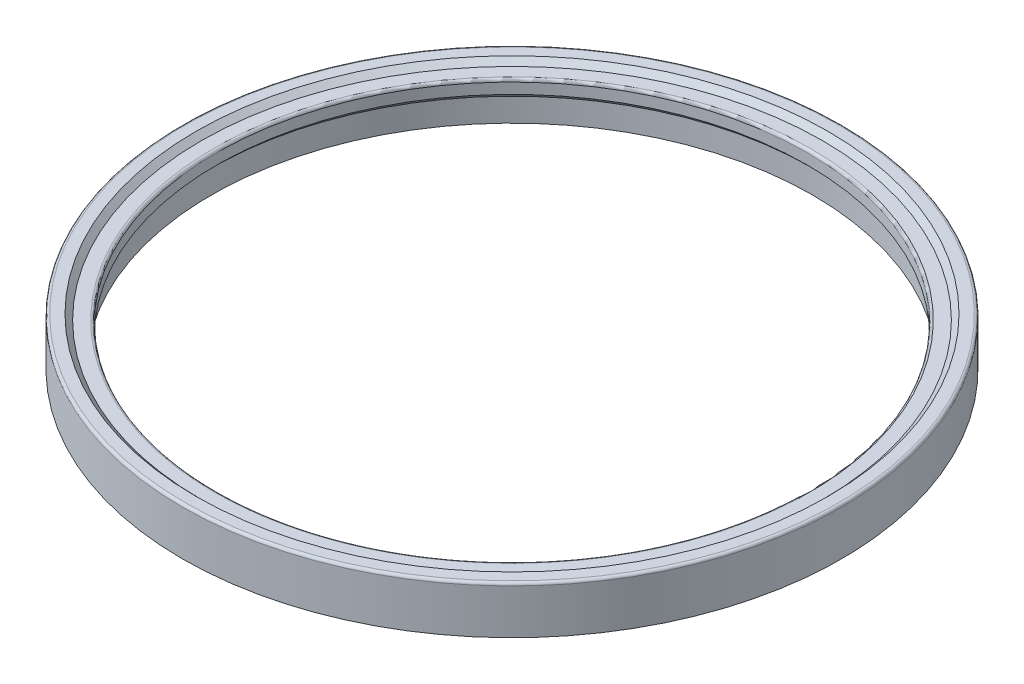
ISO-10303-21;
HEADER;
FILE_DESCRIPTION(('STEP AP214'),'2;1');
FILE_NAME('part.step','',(''),(''),'','','');
FILE_SCHEMA(('AUTOMOTIVE_DESIGN { 1 0 10303 214 1 1 1 1 }'));
ENDSEC;
DATA;
#1=APPLICATION_CONTEXT('core data for automotive mechanical design processes');
#2=APPLICATION_PROTOCOL_DEFINITION('international standard','automotive_design',2000,#1);
#3=PRODUCT_CONTEXT('',#1,'mechanical');
#4=PRODUCT('Part','Part','',(#3));
#5=PRODUCT_RELATED_PRODUCT_CATEGORY('part','',(#4));
#6=PRODUCT_DEFINITION_FORMATION('','',#4);
#7=PRODUCT_DEFINITION_CONTEXT('part definition',#1,'design');
#8=PRODUCT_DEFINITION('design','',#6,#7);
#9=PRODUCT_DEFINITION_SHAPE('','',#8);
#10=(LENGTH_UNIT() NAMED_UNIT(*) SI_UNIT(.MILLI.,.METRE.));
#11=(NAMED_UNIT(*) PLANE_ANGLE_UNIT() SI_UNIT($,.RADIAN.));
#12=(NAMED_UNIT(*) SI_UNIT($,.STERADIAN.) SOLID_ANGLE_UNIT());
#13=UNCERTAINTY_MEASURE_WITH_UNIT(LENGTH_MEASURE(1.E-05),#10,'distance_accuracy_value','');
#14=(GEOMETRIC_REPRESENTATION_CONTEXT(3) GLOBAL_UNCERTAINTY_ASSIGNED_CONTEXT((#13)) GLOBAL_UNIT_ASSIGNED_CONTEXT((#10,
#11,#12)) REPRESENTATION_CONTEXT('',''));
#15=CARTESIAN_POINT('',(0.,0.,0.));
#16=DIRECTION('',(0.,0.,1.));
#17=DIRECTION('',(1.,0.,0.));
#18=AXIS2_PLACEMENT_3D('',#15,#16,#17);
#19=CARTESIAN_POINT('',(0.,-10.9999999999939,0.));
#20=DIRECTION('',(0.,-1.,0.));
#21=DIRECTION('',(0.,0.,-1.));
#22=AXIS2_PLACEMENT_3D('',#19,#20,#21);
#23=PLANE('',#22);
#24=CARTESIAN_POINT('',(0.,-10.9999999999878,0.));
#25=DIRECTION('',(0.,-1.,0.));
#26=DIRECTION('',(0.,0.,-1.));
#27=AXIS2_PLACEMENT_3D('',#24,#25,#26);
#28=CIRCLE('',#27,124.);
#29=CARTESIAN_POINT('',(0.,-10.9999999999878,-124.));
#30=VERTEX_POINT('',#29);
#31=EDGE_CURVE('E10',#30,#30,#28,.T.);
#32=ORIENTED_EDGE('',*,*,#31,.F.);
#33=EDGE_LOOP('',(#32));
#34=FACE_BOUND('',#33,.T.);
#35=CARTESIAN_POINT('',(0.,-11.,0.));
#36=DIRECTION('',(0.,-1.,0.));
#37=DIRECTION('',(0.,0.,-1.));
#38=AXIS2_PLACEMENT_3D('',#35,#36,#37);
#39=CIRCLE('',#38,119.899137802865);
#40=CARTESIAN_POINT('',(0.,-11.,-119.899137802865));
#41=VERTEX_POINT('',#40);
#42=EDGE_CURVE('E88',#41,#41,#39,.T.);
#43=ORIENTED_EDGE('',*,*,#42,.T.);
#44=EDGE_LOOP('',(#43));
#45=FACE_BOUND('',#44,.T.);
#46=ADVANCED_FACE('F45',(#34,#45),#23,.F.);
#47=CARTESIAN_POINT('',(0.,-11.9999999999878,0.));
#48=DIRECTION('',(0.,-1.,0.));
#49=DIRECTION('',(0.,0.,-1.));
#50=AXIS2_PLACEMENT_3D('',#47,#48,#49);
#51=TOROIDAL_SURFACE('',#50,124.,1.);
#52=CARTESIAN_POINT('',(0.,-11.9999999999878,0.));
#53=DIRECTION('',(0.,-1.,0.));
#54=DIRECTION('',(0.,0.,-1.));
#55=AXIS2_PLACEMENT_3D('',#52,#53,#54);
#56=CIRCLE('',#55,125.);
#57=CARTESIAN_POINT('',(0.,-11.9999999999878,-125.));
#58=VERTEX_POINT('',#57);
#59=EDGE_CURVE('E52',#58,#58,#56,.T.);
#60=ORIENTED_EDGE('',*,*,#59,.F.);
#61=EDGE_LOOP('',(#60));
#62=FACE_BOUND('',#61,.T.);
#63=ORIENTED_EDGE('',*,*,#31,.T.);
#64=EDGE_LOOP('',(#63));
#65=FACE_BOUND('',#64,.T.);
#66=ADVANCED_FACE('F198',(#62,#65),#51,.T.);
#67=CARTESIAN_POINT('',(0.,0.,0.));
#68=DIRECTION('',(0.,-1.,0.));
#69=DIRECTION('',(0.,0.,-1.));
#70=AXIS2_PLACEMENT_3D('',#67,#68,#69);
#71=CYLINDRICAL_SURFACE('',#70,125.);
#72=CARTESIAN_POINT('',(0.,-28.9999999999878,0.));
#73=DIRECTION('',(0.,-1.,0.));
#74=DIRECTION('',(0.,0.,-1.));
#75=AXIS2_PLACEMENT_3D('',#72,#73,#74);
#76=CIRCLE('',#75,125.);
#77=CARTESIAN_POINT('',(0.,-28.9999999999878,-125.));
#78=VERTEX_POINT('',#77);
#79=EDGE_CURVE('E57',#78,#78,#76,.T.);
#80=ORIENTED_EDGE('',*,*,#79,.F.);
#81=EDGE_LOOP('',(#80));
#82=FACE_BOUND('',#81,.T.);
#83=ORIENTED_EDGE('',*,*,#59,.T.);
#84=EDGE_LOOP('',(#83));
#85=FACE_BOUND('',#84,.T.);
#86=ADVANCED_FACE('F186',(#82,#85),#71,.T.);
#87=CARTESIAN_POINT('',(0.,-28.9999999999878,0.));
#88=DIRECTION('',(0.,1.,0.));
#89=DIRECTION('',(0.,0.,1.));
#90=AXIS2_PLACEMENT_3D('',#87,#88,#89);
#91=PLANE('',#90);
#92=CARTESIAN_POINT('',(70.2550322802566,-28.9999999999878,-96.6977562526665));
#93=DIRECTION('',(0.,-1.,0.));
#94=DIRECTION('',(0.587785252292462,0.,-0.809016994374955));
#95=AXIS2_PLACEMENT_3D('',#92,#93,#94);
#96=CIRCLE('',#95,1.85);
#97=CARTESIAN_POINT('',(71.3424349969976,-28.9999999999878,-98.1944376922602));
#98=VERTEX_POINT('',#97);
#99=EDGE_CURVE('E109',#98,#98,#96,.T.);
#100=ORIENTED_EDGE('',*,*,#99,.F.);
#101=EDGE_LOOP('',(#100));
#102=FACE_BOUND('',#101,.T.);
#103=CARTESIAN_POINT('',(113.675030110178,-28.9999999999878,-36.9352562526669));
#104=DIRECTION('',(0.,-1.,0.));
#105=DIRECTION('',(0.95105651629515,0.,-0.309016994374958));
#106=AXIS2_PLACEMENT_3D('',#103,#104,#105);
#107=CIRCLE('',#106,1.85);
#108=CARTESIAN_POINT('',(115.434484665324,-28.9999999999878,-37.5069376922605));
#109=VERTEX_POINT('',#108);
#110=EDGE_CURVE('E117',#109,#109,#107,.T.);
#111=ORIENTED_EDGE('',*,*,#110,.F.);
#112=EDGE_LOOP('',(#111));
#113=FACE_BOUND('',#112,.T.);
#114=CARTESIAN_POINT('',(113.675030110179,-28.9999999999878,36.9352562526645));
#115=DIRECTION('',(0.,-1.,0.));
#116=DIRECTION('',(0.951056516295157,0.,0.309016994374938));
#117=AXIS2_PLACEMENT_3D('',#114,#115,#116);
#118=CIRCLE('',#117,1.85);
#119=CARTESIAN_POINT('',(115.434484665325,-28.9999999999878,37.5069376922581));
#120=VERTEX_POINT('',#119);
#121=EDGE_CURVE('E125',#120,#120,#118,.T.);
#122=ORIENTED_EDGE('',*,*,#121,.F.);
#123=EDGE_LOOP('',(#122));
#124=FACE_BOUND('',#123,.T.);
#125=CARTESIAN_POINT('',(70.2550322802587,-28.9999999999878,96.697756252665));
#126=DIRECTION('',(0.,-1.,0.));
#127=DIRECTION('',(0.58778525229248,0.,0.809016994374942));
#128=AXIS2_PLACEMENT_3D('',#125,#126,#127);
#129=CIRCLE('',#128,1.85);
#130=CARTESIAN_POINT('',(71.3424349969998,-28.9999999999878,98.1944376922586));
#131=VERTEX_POINT('',#130);
#132=EDGE_CURVE('E133',#131,#131,#129,.T.);
#133=ORIENTED_EDGE('',*,*,#132,.F.);
#134=EDGE_LOOP('',(#133));
#135=FACE_BOUND('',#134,.T.);
#136=CARTESIAN_POINT('',(0.,-28.9999999999878,119.525));
#137=DIRECTION('',(0.,-1.,0.));
#138=DIRECTION('',(0.,0.,1.));
#139=AXIS2_PLACEMENT_3D('',#136,#137,#138);
#140=CIRCLE('',#139,1.85);
#141=CARTESIAN_POINT('',(0.,-28.9999999999878,121.375));
#142=VERTEX_POINT('',#141);
#143=EDGE_CURVE('E141',#142,#142,#140,.T.);
#144=ORIENTED_EDGE('',*,*,#143,.F.);
#145=EDGE_LOOP('',(#144));
#146=FACE_BOUND('',#145,.T.);
#147=CARTESIAN_POINT('',(-70.2550322802573,-28.9999999999878,96.697756252666));
#148=DIRECTION('',(0.,-1.,0.));
#149=DIRECTION('',(-0.587785252292469,0.,0.809016994374951));
#150=AXIS2_PLACEMENT_3D('',#147,#148,#149);
#151=CIRCLE('',#150,1.85);
#152=CARTESIAN_POINT('',(-71.3424349969984,-28.9999999999878,98.1944376922597));
#153=VERTEX_POINT('',#152);
#154=EDGE_CURVE('E149',#153,#153,#151,.T.);
#155=ORIENTED_EDGE('',*,*,#154,.F.);
#156=EDGE_LOOP('',(#155));
#157=FACE_BOUND('',#156,.T.);
#158=CARTESIAN_POINT('',(-113.675030110178,-28.9999999999878,36.9352562526661));
#159=DIRECTION('',(0.,-1.,0.));
#160=DIRECTION('',(-0.951056516295152,0.,0.309016994374952));
#161=AXIS2_PLACEMENT_3D('',#158,#159,#160);
#162=CIRCLE('',#161,1.85);
#163=CARTESIAN_POINT('',(-115.434484665324,-28.9999999999878,37.5069376922597));
#164=VERTEX_POINT('',#163);
#165=EDGE_CURVE('E157',#164,#164,#162,.T.);
#166=ORIENTED_EDGE('',*,*,#165,.F.);
#167=EDGE_LOOP('',(#166));
#168=FACE_BOUND('',#167,.T.);
#169=CARTESIAN_POINT('',(-113.675030110178,-28.9999999999878,-36.9352562526653));
#170=DIRECTION('',(0.,-1.,0.));
#171=DIRECTION('',(-0.951056516295155,0.,-0.309016994374945));
#172=AXIS2_PLACEMENT_3D('',#169,#170,#171);
#173=CIRCLE('',#172,1.85);
#174=CARTESIAN_POINT('',(-115.434484665324,-28.9999999999878,-37.5069376922589));
#175=VERTEX_POINT('',#174);
#176=EDGE_CURVE('E165',#175,#175,#173,.T.);
#177=ORIENTED_EDGE('',*,*,#176,.F.);
#178=EDGE_LOOP('',(#177));
#179=FACE_BOUND('',#178,.T.);
#180=CARTESIAN_POINT('',(-70.255032280258,-28.9999999999878,-96.6977562526655));
#181=DIRECTION('',(0.,-1.,0.));
#182=DIRECTION('',(-0.587785252292474,0.,-0.809016994374947));
#183=AXIS2_PLACEMENT_3D('',#180,#181,#182);
#184=CIRCLE('',#183,1.85);
#185=CARTESIAN_POINT('',(-71.3424349969991,-28.9999999999878,-98.1944376922592));
#186=VERTEX_POINT('',#185);
#187=EDGE_CURVE('E101',#186,#186,#184,.T.);
#188=ORIENTED_EDGE('',*,*,#187,.F.);
#189=EDGE_LOOP('',(#188));
#190=FACE_BOUND('',#189,.T.);
#191=CARTESIAN_POINT('',(0.,-28.9999999999878,-119.525));
#192=DIRECTION('',(0.,-1.,0.));
#193=DIRECTION('',(0.,0.,-1.));
#194=AXIS2_PLACEMENT_3D('',#191,#192,#193);
#195=CIRCLE('',#194,1.85);
#196=CARTESIAN_POINT('',(0.,-28.9999999999878,-121.375));
#197=VERTEX_POINT('',#196);
#198=EDGE_CURVE('E93',#197,#197,#195,.T.);
#199=ORIENTED_EDGE('',*,*,#198,.F.);
#200=EDGE_LOOP('',(#199));
#201=FACE_BOUND('',#200,.T.);
#202=CARTESIAN_POINT('',(0.,-28.9999999999878,0.));
#203=DIRECTION('',(0.,-1.,0.));
#204=DIRECTION('',(0.,0.,-1.));
#205=AXIS2_PLACEMENT_3D('',#202,#203,#204);
#206=CIRCLE('',#205,114.05);
#207=CARTESIAN_POINT('',(0.,-28.9999999999878,-114.05));
#208=VERTEX_POINT('',#207);
#209=EDGE_CURVE('E62',#208,#208,#206,.T.);
#210=ORIENTED_EDGE('',*,*,#209,.F.);
#211=EDGE_LOOP('',(#210));
#212=FACE_BOUND('',#211,.T.);
#213=ORIENTED_EDGE('',*,*,#79,.T.);
#214=EDGE_LOOP('',(#213));
#215=FACE_BOUND('',#214,.T.);
#216=ADVANCED_FACE('F182',(#102,#113,#124,#135,#146,#157,#168,#179,#190,#201,#212,#215),#91,.F.);
#217=CARTESIAN_POINT('',(0.,0.,0.));
#218=DIRECTION('',(0.,-1.,0.));
#219=DIRECTION('',(0.,0.,-1.));
#220=AXIS2_PLACEMENT_3D('',#217,#218,#219);
#221=CYLINDRICAL_SURFACE('',#220,114.05);
#222=ORIENTED_EDGE('',*,*,#209,.T.);
#223=EDGE_LOOP('',(#222));
#224=FACE_BOUND('',#223,.T.);
#225=CARTESIAN_POINT('',(0.,-20.1508621971352,0.));
#226=DIRECTION('',(0.,-1.,0.));
#227=DIRECTION('',(0.,0.,-1.));
#228=AXIS2_PLACEMENT_3D('',#225,#226,#227);
#229=CIRCLE('',#228,114.05);
#230=CARTESIAN_POINT('',(0.,-20.1508621971352,-114.05));
#231=VERTEX_POINT('',#230);
#232=EDGE_CURVE('E68',#231,#231,#229,.T.);
#233=ORIENTED_EDGE('',*,*,#232,.F.);
#234=EDGE_LOOP('',(#233));
#235=FACE_BOUND('',#234,.T.);
#236=ADVANCED_FACE('F185',(#224,#235),#221,.F.);
#237=CARTESIAN_POINT('',(0.,-18.1008621971352,0.));
#238=DIRECTION('',(0.,-1.,0.));
#239=DIRECTION('',(0.,0.,-1.));
#240=AXIS2_PLACEMENT_3D('',#237,#238,#239);
#241=CONICAL_SURFACE('',#240,112.,0.785398163397449);
#242=ORIENTED_EDGE('',*,*,#232,.T.);
#243=EDGE_LOOP('',(#242));
#244=FACE_BOUND('',#243,.T.);
#245=CARTESIAN_POINT('',(0.,-18.1008621971352,0.));
#246=DIRECTION('',(0.,-1.,0.));
#247=DIRECTION('',(0.,0.,-1.));
#248=AXIS2_PLACEMENT_3D('',#245,#246,#247);
#249=CIRCLE('',#248,112.);
#250=CARTESIAN_POINT('',(0.,-18.1008621971352,-112.));
#251=VERTEX_POINT('',#250);
#252=EDGE_CURVE('E72',#251,#251,#249,.T.);
#253=ORIENTED_EDGE('',*,*,#252,.F.);
#254=EDGE_LOOP('',(#253));
#255=FACE_BOUND('',#254,.T.);
#256=ADVANCED_FACE('F233',(#244,#255),#241,.F.);
#257=CARTESIAN_POINT('',(0.,0.,0.));
#258=DIRECTION('',(0.,-1.,0.));
#259=DIRECTION('',(0.,0.,-1.));
#260=AXIS2_PLACEMENT_3D('',#257,#258,#259);
#261=CYLINDRICAL_SURFACE('',#260,112.);
#262=ORIENTED_EDGE('',*,*,#252,.T.);
#263=EDGE_LOOP('',(#262));
#264=FACE_BOUND('',#263,.T.);
#265=CARTESIAN_POINT('',(0.,-14.0499999999878,0.));
#266=DIRECTION('',(0.,-1.,0.));
#267=DIRECTION('',(0.,0.,-1.));
#268=AXIS2_PLACEMENT_3D('',#265,#266,#267);
#269=CIRCLE('',#268,112.);
#270=CARTESIAN_POINT('',(0.,-14.0499999999878,-112.));
#271=VERTEX_POINT('',#270);
#272=EDGE_CURVE('E76',#271,#271,#269,.T.);
#273=ORIENTED_EDGE('',*,*,#272,.F.);
#274=EDGE_LOOP('',(#273));
#275=FACE_BOUND('',#274,.T.);
#276=ADVANCED_FACE('F226',(#264,#275),#261,.F.);
#277=CARTESIAN_POINT('',(0.,-14.0499999999878,0.));
#278=DIRECTION('',(0.,-1.,0.));
#279=DIRECTION('',(0.,0.,-1.));
#280=AXIS2_PLACEMENT_3D('',#277,#278,#279);
#281=TOROIDAL_SURFACE('',#280,113.,1.);
#282=CARTESIAN_POINT('',(0.,-13.0499999999878,0.));
#283=DIRECTION('',(0.,-1.,0.));
#284=DIRECTION('',(0.,0.,-1.));
#285=AXIS2_PLACEMENT_3D('',#282,#283,#284);
#286=CIRCLE('',#285,113.);
#287=CARTESIAN_POINT('',(0.,-13.0499999999878,-113.));
#288=VERTEX_POINT('',#287);
#289=EDGE_CURVE('E80',#288,#288,#286,.T.);
#290=ORIENTED_EDGE('',*,*,#289,.F.);
#291=EDGE_LOOP('',(#290));
#292=FACE_BOUND('',#291,.T.);
#293=ORIENTED_EDGE('',*,*,#272,.T.);
#294=EDGE_LOOP('',(#293));
#295=FACE_BOUND('',#294,.T.);
#296=ADVANCED_FACE('F220',(#292,#295),#281,.T.);
#297=CARTESIAN_POINT('',(3.29641933573119E-11,-13.0499999999939,0.));
#298=DIRECTION('',(0.,1.,0.));
#299=DIRECTION('',(0.,0.,1.));
#300=AXIS2_PLACEMENT_3D('',#297,#298,#299);
#301=PLANE('',#300);
#302=ORIENTED_EDGE('',*,*,#289,.T.);
#303=EDGE_LOOP('',(#302));
#304=FACE_BOUND('',#303,.T.);
#305=CARTESIAN_POINT('',(0.,-13.05,0.));
#306=DIRECTION('',(0.,-1.,0.));
#307=DIRECTION('',(0.,0.,-1.));
#308=AXIS2_PLACEMENT_3D('',#305,#306,#307);
#309=CIRCLE('',#308,117.849137802865);
#310=CARTESIAN_POINT('',(0.,-13.05,-117.849137802865));
#311=VERTEX_POINT('',#310);
#312=EDGE_CURVE('E84',#311,#311,#309,.T.);
#313=ORIENTED_EDGE('',*,*,#312,.F.);
#314=EDGE_LOOP('',(#313));
#315=FACE_BOUND('',#314,.T.);
#316=ADVANCED_FACE('F215',(#304,#315),#301,.T.);
#317=CARTESIAN_POINT('',(0.,-13.05,0.));
#318=DIRECTION('',(0.,1.,0.));
#319=DIRECTION('',(0.,0.,1.));
#320=AXIS2_PLACEMENT_3D('',#317,#318,#319);
#321=CONICAL_SURFACE('',#320,117.849137802865,0.785398163397452);
#322=ORIENTED_EDGE('',*,*,#42,.F.);
#323=EDGE_LOOP('',(#322));
#324=FACE_BOUND('',#323,.T.);
#325=ORIENTED_EDGE('',*,*,#312,.T.);
#326=EDGE_LOOP('',(#325));
#327=FACE_BOUND('',#326,.T.);
#328=ADVANCED_FACE('F211',(#324,#327),#321,.F.);
#329=CARTESIAN_POINT('',(0.,-22.9999999999878,-119.525));
#330=DIRECTION('',(0.,-1.,0.));
#331=DIRECTION('',(0.,0.,-1.));
#332=AXIS2_PLACEMENT_3D('',#329,#330,#331);
#333=CYLINDRICAL_SURFACE('',#332,1.85);
#334=CARTESIAN_POINT('',(0.,-22.9999999999878,-119.525));
#335=DIRECTION('',(0.,-1.,0.));
#336=DIRECTION('',(0.,0.,-1.));
#337=AXIS2_PLACEMENT_3D('',#334,#335,#336);
#338=CIRCLE('',#337,1.85);
#339=CARTESIAN_POINT('',(0.,-22.9999999999878,-121.375));
#340=VERTEX_POINT('',#339);
#341=EDGE_CURVE('E92',#340,#340,#338,.T.);
#342=ORIENTED_EDGE('',*,*,#341,.F.);
#343=EDGE_LOOP('',(#342));
#344=FACE_BOUND('',#343,.T.);
#345=ORIENTED_EDGE('',*,*,#198,.T.);
#346=EDGE_LOOP('',(#345));
#347=FACE_BOUND('',#346,.T.);
#348=ADVANCED_FACE('F214',(#344,#347),#333,.F.);
#349=CARTESIAN_POINT('',(0.,-22.9999999999878,-119.525));
#350=DIRECTION('',(0.,-1.,0.));
#351=DIRECTION('',(0.,0.,-1.));
#352=AXIS2_PLACEMENT_3D('',#349,#350,#351);
#353=PLANE('',#352);
#354=ORIENTED_EDGE('',*,*,#341,.T.);
#355=EDGE_LOOP('',(#354));
#356=FACE_BOUND('',#355,.T.);
#357=ADVANCED_FACE('F285',(#356),#353,.T.);
#358=CARTESIAN_POINT('',(-70.255032280258,-22.9999999999878,-96.6977562526655));
#359=DIRECTION('',(0.,-1.,0.));
#360=DIRECTION('',(0.,0.,-1.));
#361=AXIS2_PLACEMENT_3D('',#358,#359,#360);
#362=CYLINDRICAL_SURFACE('',#361,1.85);
#363=CARTESIAN_POINT('',(-70.255032280258,-22.9999999999878,-96.6977562526655));
#364=DIRECTION('',(0.,-1.,0.));
#365=DIRECTION('',(-0.587785252292474,0.,-0.809016994374947));
#366=AXIS2_PLACEMENT_3D('',#363,#364,#365);
#367=CIRCLE('',#366,1.85);
#368=CARTESIAN_POINT('',(-71.3424349969991,-22.9999999999878,-98.1944376922592));
#369=VERTEX_POINT('',#368);
#370=EDGE_CURVE('E97',#369,#369,#367,.T.);
#371=ORIENTED_EDGE('',*,*,#370,.F.);
#372=EDGE_LOOP('',(#371));
#373=FACE_BOUND('',#372,.T.);
#374=ORIENTED_EDGE('',*,*,#187,.T.);
#375=EDGE_LOOP('',(#374));
#376=FACE_BOUND('',#375,.T.);
#377=ADVANCED_FACE('F294',(#373,#376),#362,.F.);
#378=CARTESIAN_POINT('',(-70.255032280258,-22.9999999999878,-96.6977562526655));
#379=DIRECTION('',(0.,-1.,0.));
#380=DIRECTION('',(-0.587785252292474,0.,-0.809016994374947));
#381=AXIS2_PLACEMENT_3D('',#378,#379,#380);
#382=PLANE('',#381);
#383=ORIENTED_EDGE('',*,*,#370,.T.);
#384=EDGE_LOOP('',(#383));
#385=FACE_BOUND('',#384,.T.);
#386=ADVANCED_FACE('F178',(#385),#382,.T.);
#387=CARTESIAN_POINT('',(-113.675030110178,-22.9999999999878,-36.9352562526653));
#388=DIRECTION('',(0.,-1.,0.));
#389=DIRECTION('',(0.,0.,-1.));
#390=AXIS2_PLACEMENT_3D('',#387,#388,#389);
#391=CYLINDRICAL_SURFACE('',#390,1.85);
#392=CARTESIAN_POINT('',(-113.675030110178,-22.9999999999878,-36.9352562526653));
#393=DIRECTION('',(0.,-1.,0.));
#394=DIRECTION('',(-0.951056516295155,0.,-0.309016994374945));
#395=AXIS2_PLACEMENT_3D('',#392,#393,#394);
#396=CIRCLE('',#395,1.85);
#397=CARTESIAN_POINT('',(-115.434484665324,-22.9999999999878,-37.5069376922589));
#398=VERTEX_POINT('',#397);
#399=EDGE_CURVE('E105',#398,#398,#396,.T.);
#400=ORIENTED_EDGE('',*,*,#399,.F.);
#401=EDGE_LOOP('',(#400));
#402=FACE_BOUND('',#401,.T.);
#403=ORIENTED_EDGE('',*,*,#176,.T.);
#404=EDGE_LOOP('',(#403));
#405=FACE_BOUND('',#404,.T.);
#406=ADVANCED_FACE('F175',(#402,#405),#391,.F.);
#407=CARTESIAN_POINT('',(-113.675030110178,-22.9999999999878,-36.9352562526653));
#408=DIRECTION('',(0.,-1.,0.));
#409=DIRECTION('',(-0.951056516295155,0.,-0.309016994374945));
#410=AXIS2_PLACEMENT_3D('',#407,#408,#409);
#411=PLANE('',#410);
#412=ORIENTED_EDGE('',*,*,#399,.T.);
#413=EDGE_LOOP('',(#412));
#414=FACE_BOUND('',#413,.T.);
#415=ADVANCED_FACE('F173',(#414),#411,.T.);
#416=CARTESIAN_POINT('',(-113.675030110178,-22.9999999999878,36.9352562526661));
#417=DIRECTION('',(0.,-1.,0.));
#418=DIRECTION('',(0.,0.,-1.));
#419=AXIS2_PLACEMENT_3D('',#416,#417,#418);
#420=CYLINDRICAL_SURFACE('',#419,1.85);
#421=CARTESIAN_POINT('',(-113.675030110178,-22.9999999999878,36.9352562526661));
#422=DIRECTION('',(0.,-1.,0.));
#423=DIRECTION('',(-0.951056516295152,0.,0.309016994374952));
#424=AXIS2_PLACEMENT_3D('',#421,#422,#423);
#425=CIRCLE('',#424,1.85);
#426=CARTESIAN_POINT('',(-115.434484665324,-22.9999999999878,37.5069376922597));
#427=VERTEX_POINT('',#426);
#428=EDGE_CURVE('E161',#427,#427,#425,.T.);
#429=ORIENTED_EDGE('',*,*,#428,.F.);
#430=EDGE_LOOP('',(#429));
#431=FACE_BOUND('',#430,.T.);
#432=ORIENTED_EDGE('',*,*,#165,.T.);
#433=EDGE_LOOP('',(#432));
#434=FACE_BOUND('',#433,.T.);
#435=ADVANCED_FACE('F339',(#431,#434),#420,.F.);
#436=CARTESIAN_POINT('',(-113.675030110178,-22.9999999999878,36.9352562526661));
#437=DIRECTION('',(0.,-1.,0.));
#438=DIRECTION('',(-0.951056516295152,0.,0.309016994374952));
#439=AXIS2_PLACEMENT_3D('',#436,#437,#438);
#440=PLANE('',#439);
#441=ORIENTED_EDGE('',*,*,#428,.T.);
#442=EDGE_LOOP('',(#441));
#443=FACE_BOUND('',#442,.T.);
#444=ADVANCED_FACE('F349',(#443),#440,.T.);
#445=CARTESIAN_POINT('',(-70.2550322802573,-22.9999999999878,96.697756252666));
#446=DIRECTION('',(0.,-1.,0.));
#447=DIRECTION('',(0.,0.,-1.));
#448=AXIS2_PLACEMENT_3D('',#445,#446,#447);
#449=CYLINDRICAL_SURFACE('',#448,1.85);
#450=CARTESIAN_POINT('',(-70.2550322802573,-22.9999999999878,96.697756252666));
#451=DIRECTION('',(0.,-1.,0.));
#452=DIRECTION('',(-0.587785252292469,0.,0.809016994374951));
#453=AXIS2_PLACEMENT_3D('',#450,#451,#452);
#454=CIRCLE('',#453,1.85);
#455=CARTESIAN_POINT('',(-71.3424349969984,-22.9999999999878,98.1944376922597));
#456=VERTEX_POINT('',#455);
#457=EDGE_CURVE('E153',#456,#456,#454,.T.);
#458=ORIENTED_EDGE('',*,*,#457,.F.);
#459=EDGE_LOOP('',(#458));
#460=FACE_BOUND('',#459,.T.);
#461=ORIENTED_EDGE('',*,*,#154,.T.);
#462=EDGE_LOOP('',(#461));
#463=FACE_BOUND('',#462,.T.);
#464=ADVANCED_FACE('F360',(#460,#463),#449,.F.);
#465=CARTESIAN_POINT('',(-70.2550322802573,-22.9999999999878,96.697756252666));
#466=DIRECTION('',(0.,-1.,0.));
#467=DIRECTION('',(-0.587785252292469,0.,0.809016994374951));
#468=AXIS2_PLACEMENT_3D('',#465,#466,#467);
#469=PLANE('',#468);
#470=ORIENTED_EDGE('',*,*,#457,.T.);
#471=EDGE_LOOP('',(#470));
#472=FACE_BOUND('',#471,.T.);
#473=ADVANCED_FACE('F371',(#472),#469,.T.);
#474=CARTESIAN_POINT('',(0.,-22.9999999999878,119.525));
#475=DIRECTION('',(0.,-1.,0.));
#476=DIRECTION('',(0.,0.,-1.));
#477=AXIS2_PLACEMENT_3D('',#474,#475,#476);
#478=CYLINDRICAL_SURFACE('',#477,1.85);
#479=CARTESIAN_POINT('',(0.,-22.9999999999878,119.525));
#480=DIRECTION('',(0.,-1.,0.));
#481=DIRECTION('',(0.,0.,1.));
#482=AXIS2_PLACEMENT_3D('',#479,#480,#481);
#483=CIRCLE('',#482,1.85);
#484=CARTESIAN_POINT('',(0.,-22.9999999999878,121.375));
#485=VERTEX_POINT('',#484);
#486=EDGE_CURVE('E145',#485,#485,#483,.T.);
#487=ORIENTED_EDGE('',*,*,#486,.F.);
#488=EDGE_LOOP('',(#487));
#489=FACE_BOUND('',#488,.T.);
#490=ORIENTED_EDGE('',*,*,#143,.T.);
#491=EDGE_LOOP('',(#490));
#492=FACE_BOUND('',#491,.T.);
#493=ADVANCED_FACE('F382',(#489,#492),#478,.F.);
#494=CARTESIAN_POINT('',(0.,-22.9999999999878,119.525));
#495=DIRECTION('',(0.,-1.,0.));
#496=DIRECTION('',(0.,0.,1.));
#497=AXIS2_PLACEMENT_3D('',#494,#495,#496);
#498=PLANE('',#497);
#499=ORIENTED_EDGE('',*,*,#486,.T.);
#500=EDGE_LOOP('',(#499));
#501=FACE_BOUND('',#500,.T.);
#502=ADVANCED_FACE('F393',(#501),#498,.T.);
#503=CARTESIAN_POINT('',(70.2550322802587,-22.9999999999878,96.697756252665));
#504=DIRECTION('',(0.,-1.,0.));
#505=DIRECTION('',(0.,0.,-1.));
#506=AXIS2_PLACEMENT_3D('',#503,#504,#505);
#507=CYLINDRICAL_SURFACE('',#506,1.85);
#508=CARTESIAN_POINT('',(70.2550322802587,-22.9999999999878,96.697756252665));
#509=DIRECTION('',(0.,-1.,0.));
#510=DIRECTION('',(0.58778525229248,0.,0.809016994374942));
#511=AXIS2_PLACEMENT_3D('',#508,#509,#510);
#512=CIRCLE('',#511,1.85);
#513=CARTESIAN_POINT('',(71.3424349969998,-22.9999999999878,98.1944376922586));
#514=VERTEX_POINT('',#513);
#515=EDGE_CURVE('E137',#514,#514,#512,.T.);
#516=ORIENTED_EDGE('',*,*,#515,.F.);
#517=EDGE_LOOP('',(#516));
#518=FACE_BOUND('',#517,.T.);
#519=ORIENTED_EDGE('',*,*,#132,.T.);
#520=EDGE_LOOP('',(#519));
#521=FACE_BOUND('',#520,.T.);
#522=ADVANCED_FACE('F404',(#518,#521),#507,.F.);
#523=CARTESIAN_POINT('',(70.2550322802587,-22.9999999999878,96.697756252665));
#524=DIRECTION('',(0.,-1.,0.));
#525=DIRECTION('',(0.58778525229248,0.,0.809016994374942));
#526=AXIS2_PLACEMENT_3D('',#523,#524,#525);
#527=PLANE('',#526);
#528=ORIENTED_EDGE('',*,*,#515,.T.);
#529=EDGE_LOOP('',(#528));
#530=FACE_BOUND('',#529,.T.);
#531=ADVANCED_FACE('F415',(#530),#527,.T.);
#532=CARTESIAN_POINT('',(113.675030110179,-22.9999999999878,36.9352562526645));
#533=DIRECTION('',(0.,-1.,0.));
#534=DIRECTION('',(0.,0.,-1.));
#535=AXIS2_PLACEMENT_3D('',#532,#533,#534);
#536=CYLINDRICAL_SURFACE('',#535,1.85);
#537=CARTESIAN_POINT('',(113.675030110179,-22.9999999999878,36.9352562526645));
#538=DIRECTION('',(0.,-1.,0.));
#539=DIRECTION('',(0.951056516295157,0.,0.309016994374938));
#540=AXIS2_PLACEMENT_3D('',#537,#538,#539);
#541=CIRCLE('',#540,1.85);
#542=CARTESIAN_POINT('',(115.434484665325,-22.9999999999878,37.5069376922581));
#543=VERTEX_POINT('',#542);
#544=EDGE_CURVE('E129',#543,#543,#541,.T.);
#545=ORIENTED_EDGE('',*,*,#544,.F.);
#546=EDGE_LOOP('',(#545));
#547=FACE_BOUND('',#546,.T.);
#548=ORIENTED_EDGE('',*,*,#121,.T.);
#549=EDGE_LOOP('',(#548));
#550=FACE_BOUND('',#549,.T.);
#551=ADVANCED_FACE('F426',(#547,#550),#536,.F.);
#552=CARTESIAN_POINT('',(113.675030110179,-22.9999999999878,36.9352562526645));
#553=DIRECTION('',(0.,-1.,0.));
#554=DIRECTION('',(0.951056516295157,0.,0.309016994374938));
#555=AXIS2_PLACEMENT_3D('',#552,#553,#554);
#556=PLANE('',#555);
#557=ORIENTED_EDGE('',*,*,#544,.T.);
#558=EDGE_LOOP('',(#557));
#559=FACE_BOUND('',#558,.T.);
#560=ADVANCED_FACE('F437',(#559),#556,.T.);
#561=CARTESIAN_POINT('',(113.675030110178,-22.9999999999878,-36.9352562526669));
#562=DIRECTION('',(0.,-1.,0.));
#563=DIRECTION('',(0.,0.,-1.));
#564=AXIS2_PLACEMENT_3D('',#561,#562,#563);
#565=CYLINDRICAL_SURFACE('',#564,1.85);
#566=CARTESIAN_POINT('',(113.675030110178,-22.9999999999878,-36.9352562526669));
#567=DIRECTION('',(0.,-1.,0.));
#568=DIRECTION('',(0.95105651629515,0.,-0.309016994374958));
#569=AXIS2_PLACEMENT_3D('',#566,#567,#568);
#570=CIRCLE('',#569,1.85);
#571=CARTESIAN_POINT('',(115.434484665324,-22.9999999999878,-37.5069376922605));
#572=VERTEX_POINT('',#571);
#573=EDGE_CURVE('E121',#572,#572,#570,.T.);
#574=ORIENTED_EDGE('',*,*,#573,.F.);
#575=EDGE_LOOP('',(#574));
#576=FACE_BOUND('',#575,.T.);
#577=ORIENTED_EDGE('',*,*,#110,.T.);
#578=EDGE_LOOP('',(#577));
#579=FACE_BOUND('',#578,.T.);
#580=ADVANCED_FACE('F448',(#576,#579),#565,.F.);
#581=CARTESIAN_POINT('',(113.675030110178,-22.9999999999878,-36.9352562526669));
#582=DIRECTION('',(0.,-1.,0.));
#583=DIRECTION('',(0.95105651629515,0.,-0.309016994374958));
#584=AXIS2_PLACEMENT_3D('',#581,#582,#583);
#585=PLANE('',#584);
#586=ORIENTED_EDGE('',*,*,#573,.T.);
#587=EDGE_LOOP('',(#586));
#588=FACE_BOUND('',#587,.T.);
#589=ADVANCED_FACE('F459',(#588),#585,.T.);
#590=CARTESIAN_POINT('',(70.2550322802566,-22.9999999999878,-96.6977562526665));
#591=DIRECTION('',(0.,-1.,0.));
#592=DIRECTION('',(0.,0.,-1.));
#593=AXIS2_PLACEMENT_3D('',#590,#591,#592);
#594=CYLINDRICAL_SURFACE('',#593,1.85);
#595=CARTESIAN_POINT('',(70.2550322802566,-22.9999999999878,-96.6977562526665));
#596=DIRECTION('',(0.,-1.,0.));
#597=DIRECTION('',(0.587785252292462,0.,-0.809016994374955));
#598=AXIS2_PLACEMENT_3D('',#595,#596,#597);
#599=CIRCLE('',#598,1.85);
#600=CARTESIAN_POINT('',(71.3424349969976,-22.9999999999878,-98.1944376922602));
#601=VERTEX_POINT('',#600);
#602=EDGE_CURVE('E113',#601,#601,#599,.T.);
#603=ORIENTED_EDGE('',*,*,#602,.F.);
#604=EDGE_LOOP('',(#603));
#605=FACE_BOUND('',#604,.T.);
#606=ORIENTED_EDGE('',*,*,#99,.T.);
#607=EDGE_LOOP('',(#606));
#608=FACE_BOUND('',#607,.T.);
#609=ADVANCED_FACE('F470',(#605,#608),#594,.F.);
#610=CARTESIAN_POINT('',(70.2550322802566,-22.9999999999878,-96.6977562526665));
#611=DIRECTION('',(0.,-1.,0.));
#612=DIRECTION('',(0.587785252292462,0.,-0.809016994374955));
#613=AXIS2_PLACEMENT_3D('',#610,#611,#612);
#614=PLANE('',#613);
#615=ORIENTED_EDGE('',*,*,#602,.T.);
#616=EDGE_LOOP('',(#615));
#617=FACE_BOUND('',#616,.T.);
#618=ADVANCED_FACE('F481',(#617),#614,.T.);
#619=CLOSED_SHELL('',(#46,#66,#86,#216,#236,#256,#276,#296,#316,#328,#348,#357,#377,#386,#406,
#415,#435,#444,#464,#473,#493,#502,#522,#531,#551,#560,#580,#589,#609,#618));
#620=MANIFOLD_SOLID_BREP('B2',#619);
#621=ADVANCED_BREP_SHAPE_REPRESENTATION('',(#18,#620),#14);
#622=SHAPE_DEFINITION_REPRESENTATION(#9,#621);
ENDSEC;
END-ISO-10303-21;
